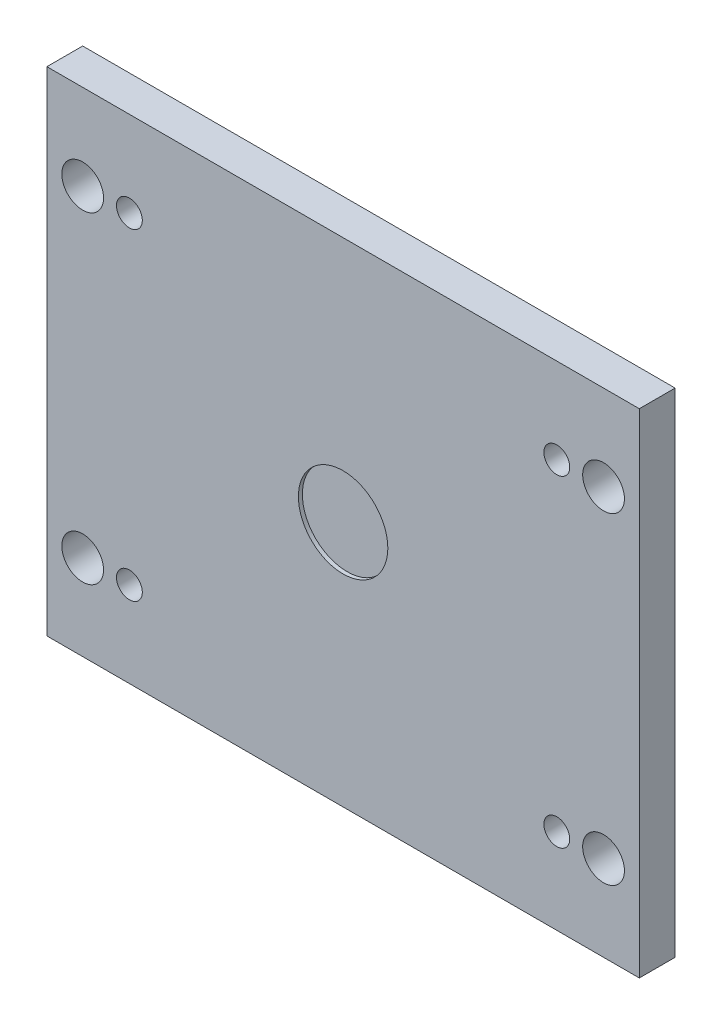
ISO-10303-21;
HEADER;
FILE_DESCRIPTION(('STEP AP214'),'2;1');
FILE_NAME('part.step','',(''),(''),'','','');
FILE_SCHEMA(('AUTOMOTIVE_DESIGN { 1 0 10303 214 1 1 1 1 }'));
ENDSEC;
DATA;
#1=APPLICATION_CONTEXT('core data for automotive mechanical design processes');
#2=APPLICATION_PROTOCOL_DEFINITION('international standard','automotive_design',2000,#1);
#3=PRODUCT_CONTEXT('',#1,'mechanical');
#4=PRODUCT('Part','Part','',(#3));
#5=PRODUCT_RELATED_PRODUCT_CATEGORY('part','',(#4));
#6=PRODUCT_DEFINITION_FORMATION('','',#4);
#7=PRODUCT_DEFINITION_CONTEXT('part definition',#1,'design');
#8=PRODUCT_DEFINITION('design','',#6,#7);
#9=PRODUCT_DEFINITION_SHAPE('','',#8);
#10=(LENGTH_UNIT() NAMED_UNIT(*) SI_UNIT(.MILLI.,.METRE.));
#11=(NAMED_UNIT(*) PLANE_ANGLE_UNIT() SI_UNIT($,.RADIAN.));
#12=(NAMED_UNIT(*) SI_UNIT($,.STERADIAN.) SOLID_ANGLE_UNIT());
#13=UNCERTAINTY_MEASURE_WITH_UNIT(LENGTH_MEASURE(1.E-05),#10,'distance_accuracy_value','');
#14=(GEOMETRIC_REPRESENTATION_CONTEXT(3) GLOBAL_UNCERTAINTY_ASSIGNED_CONTEXT((#13)) GLOBAL_UNIT_ASSIGNED_CONTEXT((#10,
#11,#12)) REPRESENTATION_CONTEXT('',''));
#15=CARTESIAN_POINT('',(0.,0.,0.));
#16=DIRECTION('',(0.,0.,1.));
#17=DIRECTION('',(1.,0.,0.));
#18=AXIS2_PLACEMENT_3D('',#15,#16,#17);
#19=CARTESIAN_POINT('',(0.,0.,36.));
#20=DIRECTION('',(0.,0.,1.));
#21=DIRECTION('',(1.,0.,0.));
#22=AXIS2_PLACEMENT_3D('',#19,#20,#21);
#23=PLANE('',#22);
#24=CARTESIAN_POINT('',(-215.,-162.,36.));
#25=DIRECTION('',(0.,0.,-1.));
#26=DIRECTION('',(-1.,0.,0.));
#27=AXIS2_PLACEMENT_3D('',#24,#25,#26);
#28=CIRCLE('',#27,13.);
#29=CARTESIAN_POINT('',(-228.,-162.,36.));
#30=VERTEX_POINT('',#29);
#31=EDGE_CURVE('E179',#30,#30,#28,.T.);
#32=ORIENTED_EDGE('',*,*,#31,.T.);
#33=EDGE_LOOP('',(#32));
#34=FACE_BOUND('',#33,.T.);
#35=CARTESIAN_POINT('',(215.,162.,36.));
#36=DIRECTION('',(0.,0.,1.));
#37=DIRECTION('',(1.,0.,0.));
#38=AXIS2_PLACEMENT_3D('',#35,#36,#37);
#39=CIRCLE('',#38,13.);
#40=CARTESIAN_POINT('',(228.,162.,36.));
#41=VERTEX_POINT('',#40);
#42=EDGE_CURVE('E158',#41,#41,#39,.T.);
#43=ORIENTED_EDGE('',*,*,#42,.F.);
#44=EDGE_LOOP('',(#43));
#45=FACE_BOUND('',#44,.T.);
#46=CARTESIAN_POINT('',(-262.,162.,36.));
#47=DIRECTION('',(0.,0.,1.));
#48=DIRECTION('',(1.,0.,0.));
#49=AXIS2_PLACEMENT_3D('',#46,#47,#48);
#50=CIRCLE('',#49,21.);
#51=CARTESIAN_POINT('',(-241.,162.,36.));
#52=VERTEX_POINT('',#51);
#53=EDGE_CURVE('E138',#52,#52,#50,.T.);
#54=ORIENTED_EDGE('',*,*,#53,.F.);
#55=EDGE_LOOP('',(#54));
#56=FACE_BOUND('',#55,.T.);
#57=CARTESIAN_POINT('',(-262.,-162.,36.));
#58=DIRECTION('',(0.,0.,1.));
#59=DIRECTION('',(1.,0.,0.));
#60=AXIS2_PLACEMENT_3D('',#57,#58,#59);
#61=CIRCLE('',#60,21.);
#62=CARTESIAN_POINT('',(-241.,-162.,36.));
#63=VERTEX_POINT('',#62);
#64=EDGE_CURVE('E132',#63,#63,#61,.T.);
#65=ORIENTED_EDGE('',*,*,#64,.F.);
#66=EDGE_LOOP('',(#65));
#67=FACE_BOUND('',#66,.T.);
#68=CARTESIAN_POINT('',(262.,-162.,36.));
#69=DIRECTION('',(0.,0.,1.));
#70=DIRECTION('',(1.,0.,0.));
#71=AXIS2_PLACEMENT_3D('',#68,#69,#70);
#72=CIRCLE('',#71,21.);
#73=CARTESIAN_POINT('',(283.,-162.,36.));
#74=VERTEX_POINT('',#73);
#75=EDGE_CURVE('E126',#74,#74,#72,.T.);
#76=ORIENTED_EDGE('',*,*,#75,.F.);
#77=EDGE_LOOP('',(#76));
#78=FACE_BOUND('',#77,.T.);
#79=CARTESIAN_POINT('',(262.,162.,36.));
#80=DIRECTION('',(0.,0.,1.));
#81=DIRECTION('',(1.,0.,0.));
#82=AXIS2_PLACEMENT_3D('',#79,#80,#81);
#83=CIRCLE('',#82,21.);
#84=CARTESIAN_POINT('',(283.,162.,36.));
#85=VERTEX_POINT('',#84);
#86=EDGE_CURVE('E120',#85,#85,#83,.T.);
#87=ORIENTED_EDGE('',*,*,#86,.F.);
#88=EDGE_LOOP('',(#87));
#89=FACE_BOUND('',#88,.T.);
#90=CARTESIAN_POINT('',(0.,0.,36.));
#91=DIRECTION('',(0.,0.,1.));
#92=DIRECTION('',(1.,0.,0.));
#93=AXIS2_PLACEMENT_3D('',#90,#91,#92);
#94=CIRCLE('',#93,45.);
#95=CARTESIAN_POINT('',(45.,0.,36.));
#96=VERTEX_POINT('',#95);
#97=EDGE_CURVE('E114',#96,#96,#94,.T.);
#98=ORIENTED_EDGE('',*,*,#97,.F.);
#99=EDGE_LOOP('',(#98));
#100=FACE_BOUND('',#99,.T.);
#101=DIRECTION('',(0.,-1.,0.));
#102=VECTOR('',#101,1.);
#103=CARTESIAN_POINT('',(-298.,248.,36.));
#104=LINE('',#103,#102);
#105=CARTESIAN_POINT('',(-298.,248.,36.));
#106=VERTEX_POINT('',#105);
#107=CARTESIAN_POINT('',(-298.,-248.,36.));
#108=VERTEX_POINT('',#107);
#109=EDGE_CURVE('E87',#106,#108,#104,.T.);
#110=ORIENTED_EDGE('',*,*,#109,.T.);
#111=DIRECTION('',(1.,0.,0.));
#112=VECTOR('',#111,1.);
#113=CARTESIAN_POINT('',(-298.,-248.,36.));
#114=LINE('',#113,#112);
#115=CARTESIAN_POINT('',(298.,-248.,36.));
#116=VERTEX_POINT('',#115);
#117=EDGE_CURVE('E82',#108,#116,#114,.T.);
#118=ORIENTED_EDGE('',*,*,#117,.T.);
#119=DIRECTION('',(0.,1.,0.));
#120=VECTOR('',#119,1.);
#121=CARTESIAN_POINT('',(298.,-248.,36.));
#122=LINE('',#121,#120);
#123=CARTESIAN_POINT('',(298.,248.,36.));
#124=VERTEX_POINT('',#123);
#125=EDGE_CURVE('E85',#116,#124,#122,.T.);
#126=ORIENTED_EDGE('',*,*,#125,.T.);
#127=DIRECTION('',(-1.,0.,0.));
#128=VECTOR('',#127,1.);
#129=CARTESIAN_POINT('',(298.,248.,36.));
#130=LINE('',#129,#128);
#131=EDGE_CURVE('E52',#124,#106,#130,.T.);
#132=ORIENTED_EDGE('',*,*,#131,.T.);
#133=EDGE_LOOP('',(#110,#118,#126,#132));
#134=FACE_BOUND('',#133,.T.);
#135=CARTESIAN_POINT('',(215.,-162.,36.));
#136=DIRECTION('',(0.,0.,-1.));
#137=DIRECTION('',(-1.,0.,0.));
#138=AXIS2_PLACEMENT_3D('',#135,#136,#137);
#139=CIRCLE('',#138,13.);
#140=CARTESIAN_POINT('',(202.,-162.,36.));
#141=VERTEX_POINT('',#140);
#142=EDGE_CURVE('E170',#141,#141,#139,.T.);
#143=ORIENTED_EDGE('',*,*,#142,.T.);
#144=EDGE_LOOP('',(#143));
#145=FACE_BOUND('',#144,.T.);
#146=CARTESIAN_POINT('',(-215.,162.,36.));
#147=DIRECTION('',(0.,0.,1.));
#148=DIRECTION('',(1.,0.,0.));
#149=AXIS2_PLACEMENT_3D('',#146,#147,#148);
#150=CIRCLE('',#149,13.);
#151=CARTESIAN_POINT('',(-202.,162.,36.));
#152=VERTEX_POINT('',#151);
#153=EDGE_CURVE('E185',#152,#152,#150,.T.);
#154=ORIENTED_EDGE('',*,*,#153,.F.);
#155=EDGE_LOOP('',(#154));
#156=FACE_BOUND('',#155,.T.);
#157=ADVANCED_FACE('F35',(#34,#45,#56,#67,#78,#89,#100,#134,#145,#156),#23,.T.);
#158=CARTESIAN_POINT('',(0.,0.,0.));
#159=DIRECTION('',(0.,0.,1.));
#160=DIRECTION('',(1.,0.,0.));
#161=AXIS2_PLACEMENT_3D('',#158,#159,#160);
#162=PLANE('',#161);
#163=CARTESIAN_POINT('',(-215.,162.,0.));
#164=DIRECTION('',(0.,0.,1.));
#165=DIRECTION('',(1.,0.,0.));
#166=AXIS2_PLACEMENT_3D('',#163,#164,#165);
#167=CIRCLE('',#166,9.00000000000001);
#168=CARTESIAN_POINT('',(-206.,162.,0.));
#169=VERTEX_POINT('',#168);
#170=EDGE_CURVE('E149',#169,#169,#167,.T.);
#171=ORIENTED_EDGE('',*,*,#170,.T.);
#172=EDGE_LOOP('',(#171));
#173=FACE_BOUND('',#172,.T.);
#174=CARTESIAN_POINT('',(215.,162.,0.));
#175=DIRECTION('',(0.,0.,1.));
#176=DIRECTION('',(1.,0.,0.));
#177=AXIS2_PLACEMENT_3D('',#174,#175,#176);
#178=CIRCLE('',#177,9.00000000000001);
#179=CARTESIAN_POINT('',(224.,162.,0.));
#180=VERTEX_POINT('',#179);
#181=EDGE_CURVE('E141',#180,#180,#178,.T.);
#182=ORIENTED_EDGE('',*,*,#181,.T.);
#183=EDGE_LOOP('',(#182));
#184=FACE_BOUND('',#183,.T.);
#185=CARTESIAN_POINT('',(-262.,162.,0.));
#186=DIRECTION('',(0.,0.,1.));
#187=DIRECTION('',(1.,0.,0.));
#188=AXIS2_PLACEMENT_3D('',#185,#186,#187);
#189=CIRCLE('',#188,21.);
#190=CARTESIAN_POINT('',(-241.,162.,0.));
#191=VERTEX_POINT('',#190);
#192=EDGE_CURVE('E135',#191,#191,#189,.T.);
#193=ORIENTED_EDGE('',*,*,#192,.T.);
#194=EDGE_LOOP('',(#193));
#195=FACE_BOUND('',#194,.T.);
#196=CARTESIAN_POINT('',(-262.,-162.,0.));
#197=DIRECTION('',(0.,0.,1.));
#198=DIRECTION('',(1.,0.,0.));
#199=AXIS2_PLACEMENT_3D('',#196,#197,#198);
#200=CIRCLE('',#199,21.);
#201=CARTESIAN_POINT('',(-241.,-162.,0.));
#202=VERTEX_POINT('',#201);
#203=EDGE_CURVE('E129',#202,#202,#200,.T.);
#204=ORIENTED_EDGE('',*,*,#203,.T.);
#205=EDGE_LOOP('',(#204));
#206=FACE_BOUND('',#205,.T.);
#207=CARTESIAN_POINT('',(262.,-162.,0.));
#208=DIRECTION('',(0.,0.,1.));
#209=DIRECTION('',(1.,0.,0.));
#210=AXIS2_PLACEMENT_3D('',#207,#208,#209);
#211=CIRCLE('',#210,21.);
#212=CARTESIAN_POINT('',(283.,-162.,0.));
#213=VERTEX_POINT('',#212);
#214=EDGE_CURVE('E123',#213,#213,#211,.T.);
#215=ORIENTED_EDGE('',*,*,#214,.T.);
#216=EDGE_LOOP('',(#215));
#217=FACE_BOUND('',#216,.T.);
#218=CARTESIAN_POINT('',(262.,162.,0.));
#219=DIRECTION('',(0.,0.,1.));
#220=DIRECTION('',(1.,0.,0.));
#221=AXIS2_PLACEMENT_3D('',#218,#219,#220);
#222=CIRCLE('',#221,21.);
#223=CARTESIAN_POINT('',(283.,162.,0.));
#224=VERTEX_POINT('',#223);
#225=EDGE_CURVE('E117',#224,#224,#222,.T.);
#226=ORIENTED_EDGE('',*,*,#225,.T.);
#227=EDGE_LOOP('',(#226));
#228=FACE_BOUND('',#227,.T.);
#229=DIRECTION('',(0.,-1.,0.));
#230=VECTOR('',#229,1.);
#231=CARTESIAN_POINT('',(-298.,248.,0.));
#232=LINE('',#231,#230);
#233=CARTESIAN_POINT('',(-298.,248.,0.));
#234=VERTEX_POINT('',#233);
#235=CARTESIAN_POINT('',(-298.,-248.,0.));
#236=VERTEX_POINT('',#235);
#237=EDGE_CURVE('E99',#234,#236,#232,.T.);
#238=ORIENTED_EDGE('',*,*,#237,.F.);
#239=DIRECTION('',(-1.,0.,0.));
#240=VECTOR('',#239,1.);
#241=CARTESIAN_POINT('',(298.,248.,0.));
#242=LINE('',#241,#240);
#243=CARTESIAN_POINT('',(298.,248.,0.));
#244=VERTEX_POINT('',#243);
#245=EDGE_CURVE('E75',#244,#234,#242,.T.);
#246=ORIENTED_EDGE('',*,*,#245,.F.);
#247=DIRECTION('',(0.,1.,0.));
#248=VECTOR('',#247,1.);
#249=CARTESIAN_POINT('',(298.,-248.,0.));
#250=LINE('',#249,#248);
#251=CARTESIAN_POINT('',(298.,-248.,0.));
#252=VERTEX_POINT('',#251);
#253=EDGE_CURVE('E69',#252,#244,#250,.T.);
#254=ORIENTED_EDGE('',*,*,#253,.F.);
#255=DIRECTION('',(1.,0.,0.));
#256=VECTOR('',#255,1.);
#257=CARTESIAN_POINT('',(-298.,-248.,0.));
#258=LINE('',#257,#256);
#259=EDGE_CURVE('E91',#236,#252,#258,.T.);
#260=ORIENTED_EDGE('',*,*,#259,.F.);
#261=EDGE_LOOP('',(#238,#246,#254,#260));
#262=FACE_BOUND('',#261,.T.);
#263=CARTESIAN_POINT('',(215.,-162.,0.));
#264=DIRECTION('',(0.,0.,-1.));
#265=DIRECTION('',(-1.,0.,0.));
#266=AXIS2_PLACEMENT_3D('',#263,#264,#265);
#267=CIRCLE('',#266,9.00000000000001);
#268=CARTESIAN_POINT('',(206.,-162.,0.));
#269=VERTEX_POINT('',#268);
#270=EDGE_CURVE('E146',#269,#269,#267,.T.);
#271=ORIENTED_EDGE('',*,*,#270,.F.);
#272=EDGE_LOOP('',(#271));
#273=FACE_BOUND('',#272,.T.);
#274=CARTESIAN_POINT('',(-215.,-162.,0.));
#275=DIRECTION('',(0.,0.,-1.));
#276=DIRECTION('',(-1.,0.,0.));
#277=AXIS2_PLACEMENT_3D('',#274,#275,#276);
#278=CIRCLE('',#277,9.00000000000001);
#279=CARTESIAN_POINT('',(-224.,-162.,0.));
#280=VERTEX_POINT('',#279);
#281=EDGE_CURVE('E152',#280,#280,#278,.T.);
#282=ORIENTED_EDGE('',*,*,#281,.F.);
#283=EDGE_LOOP('',(#282));
#284=FACE_BOUND('',#283,.T.);
#285=ADVANCED_FACE('F110',(#173,#184,#195,#206,#217,#228,#262,#273,#284),#162,.F.);
#286=CARTESIAN_POINT('',(-298.,248.,36.));
#287=DIRECTION('',(1.,0.,0.));
#288=DIRECTION('',(0.,0.,-1.));
#289=AXIS2_PLACEMENT_3D('',#286,#287,#288);
#290=PLANE('',#289);
#291=ORIENTED_EDGE('',*,*,#237,.T.);
#292=DIRECTION('',(0.,0.,-1.));
#293=VECTOR('',#292,1.);
#294=CARTESIAN_POINT('',(-298.,-248.,36.));
#295=LINE('',#294,#293);
#296=EDGE_CURVE('E11',#108,#236,#295,.T.);
#297=ORIENTED_EDGE('',*,*,#296,.F.);
#298=ORIENTED_EDGE('',*,*,#109,.F.);
#299=DIRECTION('',(0.,0.,-1.));
#300=VECTOR('',#299,1.);
#301=CARTESIAN_POINT('',(-298.,248.,36.));
#302=LINE('',#301,#300);
#303=EDGE_CURVE('E95',#106,#234,#302,.T.);
#304=ORIENTED_EDGE('',*,*,#303,.T.);
#305=EDGE_LOOP('',(#291,#297,#298,#304));
#306=FACE_BOUND('',#305,.T.);
#307=ADVANCED_FACE('F37',(#306),#290,.F.);
#308=CARTESIAN_POINT('',(-298.,-248.,36.));
#309=DIRECTION('',(0.,1.,0.));
#310=DIRECTION('',(0.,0.,1.));
#311=AXIS2_PLACEMENT_3D('',#308,#309,#310);
#312=PLANE('',#311);
#313=ORIENTED_EDGE('',*,*,#259,.T.);
#314=DIRECTION('',(0.,0.,-1.));
#315=VECTOR('',#314,1.);
#316=CARTESIAN_POINT('',(298.,-248.,36.));
#317=LINE('',#316,#315);
#318=EDGE_CURVE('E44',#116,#252,#317,.T.);
#319=ORIENTED_EDGE('',*,*,#318,.F.);
#320=ORIENTED_EDGE('',*,*,#117,.F.);
#321=ORIENTED_EDGE('',*,*,#296,.T.);
#322=EDGE_LOOP('',(#313,#319,#320,#321));
#323=FACE_BOUND('',#322,.T.);
#324=ADVANCED_FACE('F90',(#323),#312,.F.);
#325=CARTESIAN_POINT('',(298.,-248.,36.));
#326=DIRECTION('',(-1.,0.,0.));
#327=DIRECTION('',(0.,0.,1.));
#328=AXIS2_PLACEMENT_3D('',#325,#326,#327);
#329=PLANE('',#328);
#330=ORIENTED_EDGE('',*,*,#253,.T.);
#331=DIRECTION('',(0.,0.,-1.));
#332=VECTOR('',#331,1.);
#333=CARTESIAN_POINT('',(298.,248.,36.));
#334=LINE('',#333,#332);
#335=EDGE_CURVE('E92',#124,#244,#334,.T.);
#336=ORIENTED_EDGE('',*,*,#335,.F.);
#337=ORIENTED_EDGE('',*,*,#125,.F.);
#338=ORIENTED_EDGE('',*,*,#318,.T.);
#339=EDGE_LOOP('',(#330,#336,#337,#338));
#340=FACE_BOUND('',#339,.T.);
#341=ADVANCED_FACE('F93',(#340),#329,.F.);
#342=CARTESIAN_POINT('',(298.,248.,36.));
#343=DIRECTION('',(0.,-1.,0.));
#344=DIRECTION('',(0.,0.,-1.));
#345=AXIS2_PLACEMENT_3D('',#342,#343,#344);
#346=PLANE('',#345);
#347=ORIENTED_EDGE('',*,*,#245,.T.);
#348=ORIENTED_EDGE('',*,*,#303,.F.);
#349=ORIENTED_EDGE('',*,*,#131,.F.);
#350=ORIENTED_EDGE('',*,*,#335,.T.);
#351=EDGE_LOOP('',(#347,#348,#349,#350));
#352=FACE_BOUND('',#351,.T.);
#353=ADVANCED_FACE('F107',(#352),#346,.F.);
#354=CARTESIAN_POINT('',(0.,0.,32.));
#355=DIRECTION('',(0.,0.,1.));
#356=DIRECTION('',(1.,0.,0.));
#357=AXIS2_PLACEMENT_3D('',#354,#355,#356);
#358=CYLINDRICAL_SURFACE('',#357,45.);
#359=CARTESIAN_POINT('',(0.,0.,32.));
#360=DIRECTION('',(0.,0.,1.));
#361=DIRECTION('',(1.,0.,0.));
#362=AXIS2_PLACEMENT_3D('',#359,#360,#361);
#363=CIRCLE('',#362,45.);
#364=CARTESIAN_POINT('',(45.,0.,32.));
#365=VERTEX_POINT('',#364);
#366=EDGE_CURVE('E102',#365,#365,#363,.T.);
#367=ORIENTED_EDGE('',*,*,#366,.F.);
#368=EDGE_LOOP('',(#367));
#369=FACE_BOUND('',#368,.T.);
#370=ORIENTED_EDGE('',*,*,#97,.T.);
#371=EDGE_LOOP('',(#370));
#372=FACE_BOUND('',#371,.T.);
#373=ADVANCED_FACE('F218',(#369,#372),#358,.F.);
#374=CARTESIAN_POINT('',(0.,0.,32.));
#375=DIRECTION('',(0.,0.,1.));
#376=DIRECTION('',(1.,0.,0.));
#377=AXIS2_PLACEMENT_3D('',#374,#375,#376);
#378=PLANE('',#377);
#379=ORIENTED_EDGE('',*,*,#366,.T.);
#380=EDGE_LOOP('',(#379));
#381=FACE_BOUND('',#380,.T.);
#382=ADVANCED_FACE('F315',(#381),#378,.T.);
#383=CARTESIAN_POINT('',(262.,162.,0.));
#384=DIRECTION('',(0.,0.,1.));
#385=DIRECTION('',(1.,0.,0.));
#386=AXIS2_PLACEMENT_3D('',#383,#384,#385);
#387=CYLINDRICAL_SURFACE('',#386,21.);
#388=ORIENTED_EDGE('',*,*,#225,.F.);
#389=EDGE_LOOP('',(#388));
#390=FACE_BOUND('',#389,.T.);
#391=ORIENTED_EDGE('',*,*,#86,.T.);
#392=EDGE_LOOP('',(#391));
#393=FACE_BOUND('',#392,.T.);
#394=ADVANCED_FACE('F329',(#390,#393),#387,.F.);
#395=CARTESIAN_POINT('',(262.,-162.,0.));
#396=DIRECTION('',(0.,0.,1.));
#397=DIRECTION('',(1.,0.,0.));
#398=AXIS2_PLACEMENT_3D('',#395,#396,#397);
#399=CYLINDRICAL_SURFACE('',#398,21.);
#400=ORIENTED_EDGE('',*,*,#214,.F.);
#401=EDGE_LOOP('',(#400));
#402=FACE_BOUND('',#401,.T.);
#403=ORIENTED_EDGE('',*,*,#75,.T.);
#404=EDGE_LOOP('',(#403));
#405=FACE_BOUND('',#404,.T.);
#406=ADVANCED_FACE('F334',(#402,#405),#399,.F.);
#407=CARTESIAN_POINT('',(-262.,-162.,0.));
#408=DIRECTION('',(0.,0.,1.));
#409=DIRECTION('',(1.,0.,0.));
#410=AXIS2_PLACEMENT_3D('',#407,#408,#409);
#411=CYLINDRICAL_SURFACE('',#410,21.);
#412=ORIENTED_EDGE('',*,*,#203,.F.);
#413=EDGE_LOOP('',(#412));
#414=FACE_BOUND('',#413,.T.);
#415=ORIENTED_EDGE('',*,*,#64,.T.);
#416=EDGE_LOOP('',(#415));
#417=FACE_BOUND('',#416,.T.);
#418=ADVANCED_FACE('F349',(#414,#417),#411,.F.);
#419=CARTESIAN_POINT('',(-262.,162.,0.));
#420=DIRECTION('',(0.,0.,1.));
#421=DIRECTION('',(1.,0.,0.));
#422=AXIS2_PLACEMENT_3D('',#419,#420,#421);
#423=CYLINDRICAL_SURFACE('',#422,21.);
#424=ORIENTED_EDGE('',*,*,#192,.F.);
#425=EDGE_LOOP('',(#424));
#426=FACE_BOUND('',#425,.T.);
#427=ORIENTED_EDGE('',*,*,#53,.T.);
#428=EDGE_LOOP('',(#427));
#429=FACE_BOUND('',#428,.T.);
#430=ADVANCED_FACE('F359',(#426,#429),#423,.F.);
#431=CARTESIAN_POINT('',(215.,162.,0.));
#432=DIRECTION('',(0.,0.,1.));
#433=DIRECTION('',(1.,0.,0.));
#434=AXIS2_PLACEMENT_3D('',#431,#432,#433);
#435=CYLINDRICAL_SURFACE('',#434,9.00000000000001);
#436=CARTESIAN_POINT('',(215.,162.,15.));
#437=DIRECTION('',(0.,0.,1.));
#438=DIRECTION('',(1.,0.,0.));
#439=AXIS2_PLACEMENT_3D('',#436,#437,#438);
#440=CIRCLE('',#439,9.00000000000001);
#441=CARTESIAN_POINT('',(224.,162.,15.));
#442=VERTEX_POINT('',#441);
#443=EDGE_CURVE('E155',#442,#442,#440,.T.);
#444=ORIENTED_EDGE('',*,*,#443,.T.);
#445=EDGE_LOOP('',(#444));
#446=FACE_BOUND('',#445,.T.);
#447=ORIENTED_EDGE('',*,*,#181,.F.);
#448=EDGE_LOOP('',(#447));
#449=FACE_BOUND('',#448,.T.);
#450=ADVANCED_FACE('F369',(#446,#449),#435,.F.);
#451=CARTESIAN_POINT('',(215.,-162.,15.));
#452=DIRECTION('',(0.,0.,-1.));
#453=DIRECTION('',(-1.,0.,0.));
#454=AXIS2_PLACEMENT_3D('',#451,#452,#453);
#455=CYLINDRICAL_SURFACE('',#454,9.00000000000001);
#456=ORIENTED_EDGE('',*,*,#270,.T.);
#457=EDGE_LOOP('',(#456));
#458=FACE_BOUND('',#457,.T.);
#459=CARTESIAN_POINT('',(215.,-162.,15.));
#460=DIRECTION('',(0.,0.,1.));
#461=DIRECTION('',(1.,0.,0.));
#462=AXIS2_PLACEMENT_3D('',#459,#460,#461);
#463=CIRCLE('',#462,9.00000000000001);
#464=CARTESIAN_POINT('',(224.,-162.,15.));
#465=VERTEX_POINT('',#464);
#466=EDGE_CURVE('E164',#465,#465,#463,.T.);
#467=ORIENTED_EDGE('',*,*,#466,.T.);
#468=EDGE_LOOP('',(#467));
#469=FACE_BOUND('',#468,.T.);
#470=ADVANCED_FACE('F243',(#458,#469),#455,.F.);
#471=CARTESIAN_POINT('',(-215.,162.,0.));
#472=DIRECTION('',(0.,0.,1.));
#473=DIRECTION('',(1.,0.,0.));
#474=AXIS2_PLACEMENT_3D('',#471,#472,#473);
#475=CYLINDRICAL_SURFACE('',#474,9.00000000000001);
#476=CARTESIAN_POINT('',(-215.,162.,15.));
#477=DIRECTION('',(0.,0.,1.));
#478=DIRECTION('',(1.,0.,0.));
#479=AXIS2_PLACEMENT_3D('',#476,#477,#478);
#480=CIRCLE('',#479,9.00000000000001);
#481=CARTESIAN_POINT('',(-206.,162.,15.));
#482=VERTEX_POINT('',#481);
#483=EDGE_CURVE('E182',#482,#482,#480,.T.);
#484=ORIENTED_EDGE('',*,*,#483,.T.);
#485=EDGE_LOOP('',(#484));
#486=FACE_BOUND('',#485,.T.);
#487=ORIENTED_EDGE('',*,*,#170,.F.);
#488=EDGE_LOOP('',(#487));
#489=FACE_BOUND('',#488,.T.);
#490=ADVANCED_FACE('F247',(#486,#489),#475,.F.);
#491=CARTESIAN_POINT('',(-215.,-162.,15.));
#492=DIRECTION('',(0.,0.,-1.));
#493=DIRECTION('',(-1.,0.,0.));
#494=AXIS2_PLACEMENT_3D('',#491,#492,#493);
#495=CYLINDRICAL_SURFACE('',#494,9.00000000000001);
#496=ORIENTED_EDGE('',*,*,#281,.T.);
#497=EDGE_LOOP('',(#496));
#498=FACE_BOUND('',#497,.T.);
#499=CARTESIAN_POINT('',(-215.,-162.,15.));
#500=DIRECTION('',(0.,0.,1.));
#501=DIRECTION('',(1.,0.,0.));
#502=AXIS2_PLACEMENT_3D('',#499,#500,#501);
#503=CIRCLE('',#502,9.00000000000001);
#504=CARTESIAN_POINT('',(-206.,-162.,15.));
#505=VERTEX_POINT('',#504);
#506=EDGE_CURVE('E173',#505,#505,#503,.T.);
#507=ORIENTED_EDGE('',*,*,#506,.T.);
#508=EDGE_LOOP('',(#507));
#509=FACE_BOUND('',#508,.T.);
#510=ADVANCED_FACE('F250',(#498,#509),#495,.F.);
#511=CARTESIAN_POINT('',(215.,162.,15.));
#512=DIRECTION('',(0.,0.,1.));
#513=DIRECTION('',(1.,0.,0.));
#514=AXIS2_PLACEMENT_3D('',#511,#512,#513);
#515=CYLINDRICAL_SURFACE('',#514,13.);
#516=ORIENTED_EDGE('',*,*,#42,.T.);
#517=EDGE_LOOP('',(#516));
#518=FACE_BOUND('',#517,.T.);
#519=CARTESIAN_POINT('',(215.,162.,15.));
#520=DIRECTION('',(0.,0.,1.));
#521=DIRECTION('',(1.,0.,0.));
#522=AXIS2_PLACEMENT_3D('',#519,#520,#521);
#523=CIRCLE('',#522,13.);
#524=CARTESIAN_POINT('',(228.,162.,15.));
#525=VERTEX_POINT('',#524);
#526=EDGE_CURVE('E161',#525,#525,#523,.T.);
#527=ORIENTED_EDGE('',*,*,#526,.F.);
#528=EDGE_LOOP('',(#527));
#529=FACE_BOUND('',#528,.T.);
#530=ADVANCED_FACE('F261',(#518,#529),#515,.F.);
#531=CARTESIAN_POINT('',(215.,175.,15.));
#532=DIRECTION('',(0.,0.,1.));
#533=DIRECTION('',(1.,0.,0.));
#534=AXIS2_PLACEMENT_3D('',#531,#532,#533);
#535=PLANE('',#534);
#536=ORIENTED_EDGE('',*,*,#443,.F.);
#537=EDGE_LOOP('',(#536));
#538=FACE_BOUND('',#537,.T.);
#539=ORIENTED_EDGE('',*,*,#526,.T.);
#540=EDGE_LOOP('',(#539));
#541=FACE_BOUND('',#540,.T.);
#542=ADVANCED_FACE('F268',(#538,#541),#535,.T.);
#543=CARTESIAN_POINT('',(215.,-162.,15.));
#544=DIRECTION('',(0.,0.,1.));
#545=DIRECTION('',(1.,0.,0.));
#546=AXIS2_PLACEMENT_3D('',#543,#544,#545);
#547=PLANE('',#546);
#548=ORIENTED_EDGE('',*,*,#466,.F.);
#549=EDGE_LOOP('',(#548));
#550=FACE_BOUND('',#549,.T.);
#551=CARTESIAN_POINT('',(215.,-162.,15.));
#552=DIRECTION('',(0.,0.,-1.));
#553=DIRECTION('',(-1.,0.,0.));
#554=AXIS2_PLACEMENT_3D('',#551,#552,#553);
#555=CIRCLE('',#554,13.);
#556=CARTESIAN_POINT('',(202.,-162.,15.));
#557=VERTEX_POINT('',#556);
#558=EDGE_CURVE('E167',#557,#557,#555,.T.);
#559=ORIENTED_EDGE('',*,*,#558,.F.);
#560=EDGE_LOOP('',(#559));
#561=FACE_BOUND('',#560,.T.);
#562=ADVANCED_FACE('F277',(#550,#561),#547,.T.);
#563=CARTESIAN_POINT('',(215.,-162.,36.));
#564=DIRECTION('',(0.,0.,-1.));
#565=DIRECTION('',(-1.,0.,0.));
#566=AXIS2_PLACEMENT_3D('',#563,#564,#565);
#567=CYLINDRICAL_SURFACE('',#566,13.);
#568=ORIENTED_EDGE('',*,*,#558,.T.);
#569=EDGE_LOOP('',(#568));
#570=FACE_BOUND('',#569,.T.);
#571=ORIENTED_EDGE('',*,*,#142,.F.);
#572=EDGE_LOOP('',(#571));
#573=FACE_BOUND('',#572,.T.);
#574=ADVANCED_FACE('F286',(#570,#573),#567,.F.);
#575=CARTESIAN_POINT('',(-215.,-162.,15.));
#576=DIRECTION('',(0.,0.,1.));
#577=DIRECTION('',(1.,0.,0.));
#578=AXIS2_PLACEMENT_3D('',#575,#576,#577);
#579=PLANE('',#578);
#580=ORIENTED_EDGE('',*,*,#506,.F.);
#581=EDGE_LOOP('',(#580));
#582=FACE_BOUND('',#581,.T.);
#583=CARTESIAN_POINT('',(-215.,-162.,15.));
#584=DIRECTION('',(0.,0.,-1.));
#585=DIRECTION('',(-1.,0.,0.));
#586=AXIS2_PLACEMENT_3D('',#583,#584,#585);
#587=CIRCLE('',#586,13.);
#588=CARTESIAN_POINT('',(-228.,-162.,15.));
#589=VERTEX_POINT('',#588);
#590=EDGE_CURVE('E176',#589,#589,#587,.T.);
#591=ORIENTED_EDGE('',*,*,#590,.F.);
#592=EDGE_LOOP('',(#591));
#593=FACE_BOUND('',#592,.T.);
#594=ADVANCED_FACE('F205',(#582,#593),#579,.T.);
#595=CARTESIAN_POINT('',(-215.,-162.,36.));
#596=DIRECTION('',(0.,0.,-1.));
#597=DIRECTION('',(-1.,0.,0.));
#598=AXIS2_PLACEMENT_3D('',#595,#596,#597);
#599=CYLINDRICAL_SURFACE('',#598,13.);
#600=ORIENTED_EDGE('',*,*,#590,.T.);
#601=EDGE_LOOP('',(#600));
#602=FACE_BOUND('',#601,.T.);
#603=ORIENTED_EDGE('',*,*,#31,.F.);
#604=EDGE_LOOP('',(#603));
#605=FACE_BOUND('',#604,.T.);
#606=ADVANCED_FACE('F196',(#602,#605),#599,.F.);
#607=CARTESIAN_POINT('',(-215.,162.,15.));
#608=DIRECTION('',(0.,0.,1.));
#609=DIRECTION('',(1.,0.,0.));
#610=AXIS2_PLACEMENT_3D('',#607,#608,#609);
#611=CYLINDRICAL_SURFACE('',#610,13.);
#612=ORIENTED_EDGE('',*,*,#153,.T.);
#613=EDGE_LOOP('',(#612));
#614=FACE_BOUND('',#613,.T.);
#615=CARTESIAN_POINT('',(-215.,162.,15.));
#616=DIRECTION('',(0.,0.,1.));
#617=DIRECTION('',(1.,0.,0.));
#618=AXIS2_PLACEMENT_3D('',#615,#616,#617);
#619=CIRCLE('',#618,13.);
#620=CARTESIAN_POINT('',(-202.,162.,15.));
#621=VERTEX_POINT('',#620);
#622=EDGE_CURVE('E188',#621,#621,#619,.T.);
#623=ORIENTED_EDGE('',*,*,#622,.F.);
#624=EDGE_LOOP('',(#623));
#625=FACE_BOUND('',#624,.T.);
#626=ADVANCED_FACE('F194',(#614,#625),#611,.F.);
#627=CARTESIAN_POINT('',(-215.,175.,15.));
#628=DIRECTION('',(0.,0.,1.));
#629=DIRECTION('',(1.,0.,0.));
#630=AXIS2_PLACEMENT_3D('',#627,#628,#629);
#631=PLANE('',#630);
#632=ORIENTED_EDGE('',*,*,#483,.F.);
#633=EDGE_LOOP('',(#632));
#634=FACE_BOUND('',#633,.T.);
#635=ORIENTED_EDGE('',*,*,#622,.T.);
#636=EDGE_LOOP('',(#635));
#637=FACE_BOUND('',#636,.T.);
#638=ADVANCED_FACE('F192',(#634,#637),#631,.T.);
#639=CLOSED_SHELL('',(#157,#285,#307,#324,#341,#353,#373,#382,#394,#406,#418,#430,#450,#470,
#490,#510,#530,#542,#562,#574,#594,#606,#626,#638));
#640=MANIFOLD_SOLID_BREP('B2',#639);
#641=ADVANCED_BREP_SHAPE_REPRESENTATION('',(#18,#640),#14);
#642=SHAPE_DEFINITION_REPRESENTATION(#9,#641);
ENDSEC;
END-ISO-10303-21;
